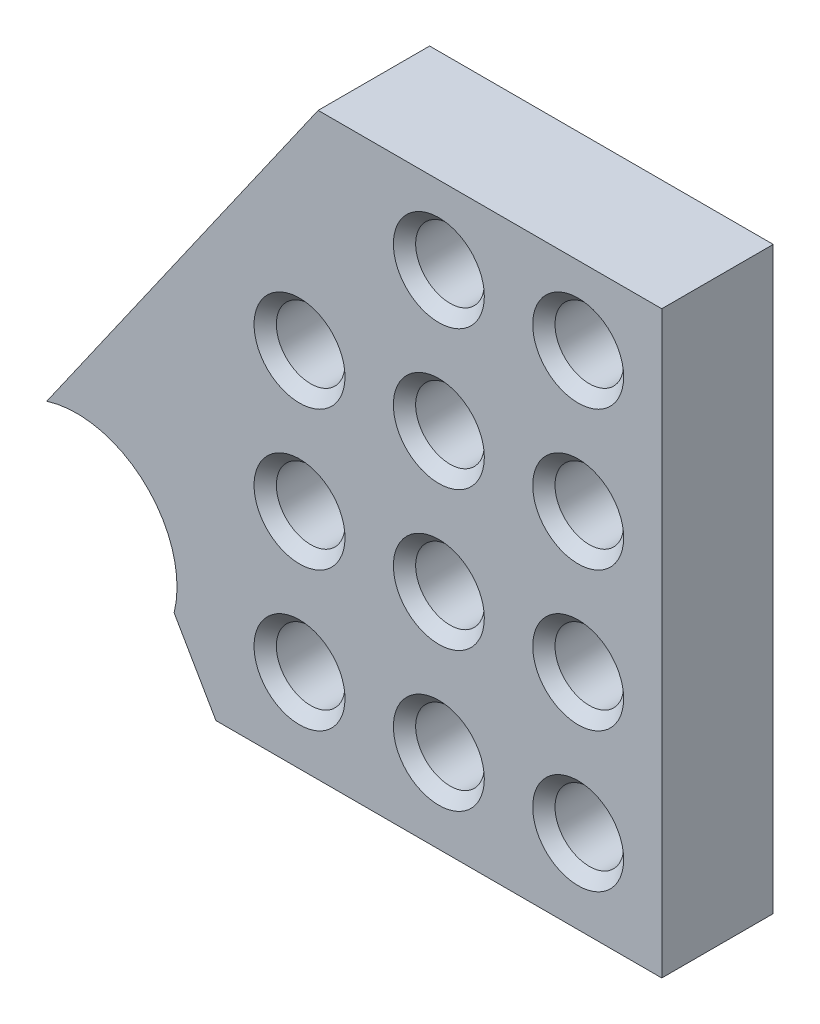
ISO-10303-21;
HEADER;
FILE_DESCRIPTION(('STEP AP214'),'2;1');
FILE_NAME('part.step','',(''),(''),'','','');
FILE_SCHEMA(('AUTOMOTIVE_DESIGN { 1 0 10303 214 1 1 1 1 }'));
ENDSEC;
DATA;
#1=APPLICATION_CONTEXT('core data for automotive mechanical design processes');
#2=APPLICATION_PROTOCOL_DEFINITION('international standard','automotive_design',2000,#1);
#3=PRODUCT_CONTEXT('',#1,'mechanical');
#4=PRODUCT('Part','Part','',(#3));
#5=PRODUCT_RELATED_PRODUCT_CATEGORY('part','',(#4));
#6=PRODUCT_DEFINITION_FORMATION('','',#4);
#7=PRODUCT_DEFINITION_CONTEXT('part definition',#1,'design');
#8=PRODUCT_DEFINITION('design','',#6,#7);
#9=PRODUCT_DEFINITION_SHAPE('','',#8);
#10=(LENGTH_UNIT() NAMED_UNIT(*) SI_UNIT(.MILLI.,.METRE.));
#11=(NAMED_UNIT(*) PLANE_ANGLE_UNIT() SI_UNIT($,.RADIAN.));
#12=(NAMED_UNIT(*) SI_UNIT($,.STERADIAN.) SOLID_ANGLE_UNIT());
#13=UNCERTAINTY_MEASURE_WITH_UNIT(LENGTH_MEASURE(1.E-05),#10,'distance_accuracy_value','');
#14=(GEOMETRIC_REPRESENTATION_CONTEXT(3) GLOBAL_UNCERTAINTY_ASSIGNED_CONTEXT((#13)) GLOBAL_UNIT_ASSIGNED_CONTEXT((#10,
#11,#12)) REPRESENTATION_CONTEXT('',''));
#15=CARTESIAN_POINT('',(0.,0.,0.));
#16=DIRECTION('',(0.,0.,1.));
#17=DIRECTION('',(1.,0.,0.));
#18=AXIS2_PLACEMENT_3D('',#15,#16,#17);
#19=CARTESIAN_POINT('',(-28.6502386222583,20.0611130548121,6.35));
#20=DIRECTION('',(0.819152044288993,-0.573576436351044,0.));
#21=DIRECTION('',(0.573576436351044,0.819152044288993,0.));
#22=AXIS2_PLACEMENT_3D('',#19,#20,#21);
#23=PLANE('',#22);
#24=DIRECTION('',(-0.573576436351044,-0.819152044288993,0.));
#25=VECTOR('',#24,1.);
#26=CARTESIAN_POINT('',(-28.6502386222583,20.0611130548121,0.));
#27=LINE('',#26,#25);
#28=CARTESIAN_POINT('',(-19.5763282964304,33.02,0.));
#29=VERTEX_POINT('',#28);
#30=CARTESIAN_POINT('',(-35.0379978292441,10.9384474758067,0.));
#31=VERTEX_POINT('',#30);
#32=EDGE_CURVE('E121',#29,#31,#27,.T.);
#33=ORIENTED_EDGE('',*,*,#32,.T.);
#34=DIRECTION('',(0.,0.,-1.));
#35=VECTOR('',#34,1.);
#36=CARTESIAN_POINT('',(-35.0379978292441,10.9384474758067,6.35));
#37=LINE('',#36,#35);
#38=CARTESIAN_POINT('',(-35.0379978292441,10.9384474758067,6.35));
#39=VERTEX_POINT('',#38);
#40=EDGE_CURVE('E11',#39,#31,#37,.T.);
#41=ORIENTED_EDGE('',*,*,#40,.F.);
#42=DIRECTION('',(-0.573576436351044,-0.819152044288993,0.));
#43=VECTOR('',#42,1.);
#44=CARTESIAN_POINT('',(-28.6502386222583,20.0611130548121,6.35));
#45=LINE('',#44,#43);
#46=CARTESIAN_POINT('',(-19.5763282964304,33.02,6.35));
#47=VERTEX_POINT('',#46);
#48=EDGE_CURVE('E132',#47,#39,#45,.T.);
#49=ORIENTED_EDGE('',*,*,#48,.F.);
#50=DIRECTION('',(0.,0.,-1.));
#51=VECTOR('',#50,1.);
#52=CARTESIAN_POINT('',(-19.5763282964304,33.02,6.35));
#53=LINE('',#52,#51);
#54=EDGE_CURVE('E117',#47,#29,#53,.T.);
#55=ORIENTED_EDGE('',*,*,#54,.T.);
#56=EDGE_LOOP('',(#33,#41,#49,#55));
#57=FACE_BOUND('',#56,.T.);
#58=ADVANCED_FACE('F37',(#57),#23,.F.);
#59=CARTESIAN_POINT('',(-33.332191415301,5.48395854666304,6.35));
#60=DIRECTION('',(0.,0.,-1.));
#61=DIRECTION('',(-1.,0.,0.));
#62=AXIS2_PLACEMENT_3D('',#59,#60,#61);
#63=CYLINDRICAL_SURFACE('',#62,5.71500000000001);
#64=CARTESIAN_POINT('',(-33.332191415301,5.48395854666304,0.));
#65=DIRECTION('',(0.,0.,1.));
#66=DIRECTION('',(1.,0.,0.));
#67=AXIS2_PLACEMENT_3D('',#64,#65,#66);
#68=CIRCLE('',#67,5.71500000000001);
#69=CARTESIAN_POINT('',(-27.78125,4.12444598552339,0.));
#70=VERTEX_POINT('',#69);
#71=EDGE_CURVE('E124',#31,#70,#68,.F.);
#72=ORIENTED_EDGE('',*,*,#71,.T.);
#73=DIRECTION('',(0.,0.,-1.));
#74=VECTOR('',#73,1.);
#75=CARTESIAN_POINT('',(-27.78125,4.12444598552339,6.35));
#76=LINE('',#75,#74);
#77=CARTESIAN_POINT('',(-27.78125,4.12444598552339,6.35));
#78=VERTEX_POINT('',#77);
#79=EDGE_CURVE('E45',#78,#70,#76,.T.);
#80=ORIENTED_EDGE('',*,*,#79,.F.);
#81=CARTESIAN_POINT('',(-33.332191415301,5.48395854666304,6.35));
#82=DIRECTION('',(0.,0.,1.));
#83=DIRECTION('',(1.,0.,0.));
#84=AXIS2_PLACEMENT_3D('',#81,#82,#83);
#85=CIRCLE('',#84,5.71500000000001);
#86=EDGE_CURVE('E90',#39,#78,#85,.F.);
#87=ORIENTED_EDGE('',*,*,#86,.F.);
#88=ORIENTED_EDGE('',*,*,#40,.T.);
#89=EDGE_LOOP('',(#72,#80,#87,#88));
#90=FACE_BOUND('',#89,.T.);
#91=ADVANCED_FACE('F157',(#90),#63,.F.);
#92=CARTESIAN_POINT('',(-19.0500000000001,-10.9985226280623,6.35));
#93=DIRECTION('',(0.86602540378444,0.499999999999998,0.));
#94=DIRECTION('',(-0.499999999999998,0.86602540378444,0.));
#95=AXIS2_PLACEMENT_3D('',#92,#93,#94);
#96=PLANE('',#95);
#97=DIRECTION('',(0.499999999999998,-0.86602540378444,0.));
#98=VECTOR('',#97,1.);
#99=CARTESIAN_POINT('',(-19.0500000000001,-10.9985226280623,0.));
#100=LINE('',#99,#98);
#101=CARTESIAN_POINT('',(-25.4,0.,0.));
#102=VERTEX_POINT('',#101);
#103=EDGE_CURVE('E127',#70,#102,#100,.T.);
#104=ORIENTED_EDGE('',*,*,#103,.T.);
#105=DIRECTION('',(0.,0.,-1.));
#106=VECTOR('',#105,1.);
#107=CARTESIAN_POINT('',(-25.4,0.,6.35));
#108=LINE('',#107,#106);
#109=CARTESIAN_POINT('',(-25.4,0.,6.35));
#110=VERTEX_POINT('',#109);
#111=EDGE_CURVE('E112',#110,#102,#108,.T.);
#112=ORIENTED_EDGE('',*,*,#111,.F.);
#113=DIRECTION('',(0.499999999999998,-0.86602540378444,0.));
#114=VECTOR('',#113,1.);
#115=CARTESIAN_POINT('',(-19.0500000000001,-10.9985226280623,6.35));
#116=LINE('',#115,#114);
#117=EDGE_CURVE('E103',#78,#110,#116,.T.);
#118=ORIENTED_EDGE('',*,*,#117,.F.);
#119=ORIENTED_EDGE('',*,*,#79,.T.);
#120=EDGE_LOOP('',(#104,#112,#118,#119));
#121=FACE_BOUND('',#120,.T.);
#122=ADVANCED_FACE('F138',(#121),#96,.F.);
#123=CARTESIAN_POINT('',(0.,0.,6.35));
#124=DIRECTION('',(0.,1.,0.));
#125=DIRECTION('',(0.,0.,1.));
#126=AXIS2_PLACEMENT_3D('',#123,#124,#125);
#127=PLANE('',#126);
#128=DIRECTION('',(1.,0.,0.));
#129=VECTOR('',#128,1.);
#130=CARTESIAN_POINT('',(0.,0.,0.));
#131=LINE('',#130,#129);
#132=CARTESIAN_POINT('',(0.,0.,0.));
#133=VERTEX_POINT('',#132);
#134=EDGE_CURVE('E111',#102,#133,#131,.T.);
#135=ORIENTED_EDGE('',*,*,#134,.T.);
#136=DIRECTION('',(0.,0.,-1.));
#137=VECTOR('',#136,1.);
#138=CARTESIAN_POINT('',(0.,0.,6.35));
#139=LINE('',#138,#137);
#140=CARTESIAN_POINT('',(0.,0.,6.35));
#141=VERTEX_POINT('',#140);
#142=EDGE_CURVE('E108',#141,#133,#139,.T.);
#143=ORIENTED_EDGE('',*,*,#142,.F.);
#144=DIRECTION('',(1.,0.,0.));
#145=VECTOR('',#144,1.);
#146=CARTESIAN_POINT('',(0.,0.,6.35));
#147=LINE('',#146,#145);
#148=EDGE_CURVE('E97',#110,#141,#147,.T.);
#149=ORIENTED_EDGE('',*,*,#148,.F.);
#150=ORIENTED_EDGE('',*,*,#111,.T.);
#151=EDGE_LOOP('',(#135,#143,#149,#150));
#152=FACE_BOUND('',#151,.T.);
#153=ADVANCED_FACE('F109',(#152),#127,.F.);
#154=CARTESIAN_POINT('',(0.,0.,6.35));
#155=DIRECTION('',(-1.,0.,0.));
#156=DIRECTION('',(0.,0.,1.));
#157=AXIS2_PLACEMENT_3D('',#154,#155,#156);
#158=PLANE('',#157);
#159=DIRECTION('',(0.,1.,0.));
#160=VECTOR('',#159,1.);
#161=CARTESIAN_POINT('',(0.,0.,0.));
#162=LINE('',#161,#160);
#163=CARTESIAN_POINT('',(0.,33.02,0.));
#164=VERTEX_POINT('',#163);
#165=EDGE_CURVE('E76',#133,#164,#162,.T.);
#166=ORIENTED_EDGE('',*,*,#165,.T.);
#167=DIRECTION('',(0.,0.,-1.));
#168=VECTOR('',#167,1.);
#169=CARTESIAN_POINT('',(0.,33.02,6.35));
#170=LINE('',#169,#168);
#171=CARTESIAN_POINT('',(0.,33.02,6.35));
#172=VERTEX_POINT('',#171);
#173=EDGE_CURVE('E113',#172,#164,#170,.T.);
#174=ORIENTED_EDGE('',*,*,#173,.F.);
#175=DIRECTION('',(0.,1.,0.));
#176=VECTOR('',#175,1.);
#177=CARTESIAN_POINT('',(0.,0.,6.35));
#178=LINE('',#177,#176);
#179=EDGE_CURVE('E101',#141,#172,#178,.T.);
#180=ORIENTED_EDGE('',*,*,#179,.F.);
#181=ORIENTED_EDGE('',*,*,#142,.T.);
#182=EDGE_LOOP('',(#166,#174,#180,#181));
#183=FACE_BOUND('',#182,.T.);
#184=ADVANCED_FACE('F115',(#183),#158,.F.);
#185=CARTESIAN_POINT('',(0.,33.02,6.35));
#186=DIRECTION('',(0.,-1.,0.));
#187=DIRECTION('',(0.,0.,-1.));
#188=AXIS2_PLACEMENT_3D('',#185,#186,#187);
#189=PLANE('',#188);
#190=DIRECTION('',(-1.,0.,0.));
#191=VECTOR('',#190,1.);
#192=CARTESIAN_POINT('',(0.,33.02,0.));
#193=LINE('',#192,#191);
#194=EDGE_CURVE('E82',#164,#29,#193,.T.);
#195=ORIENTED_EDGE('',*,*,#194,.T.);
#196=ORIENTED_EDGE('',*,*,#54,.F.);
#197=DIRECTION('',(-1.,0.,0.));
#198=VECTOR('',#197,1.);
#199=CARTESIAN_POINT('',(0.,33.02,6.35));
#200=LINE('',#199,#198);
#201=EDGE_CURVE('E53',#172,#47,#200,.T.);
#202=ORIENTED_EDGE('',*,*,#201,.F.);
#203=ORIENTED_EDGE('',*,*,#173,.T.);
#204=EDGE_LOOP('',(#195,#196,#202,#203));
#205=FACE_BOUND('',#204,.T.);
#206=ADVANCED_FACE('F145',(#205),#189,.F.);
#207=CARTESIAN_POINT('',(0.,0.,6.35));
#208=DIRECTION('',(0.,0.,1.));
#209=DIRECTION('',(1.,0.,0.));
#210=AXIS2_PLACEMENT_3D('',#207,#208,#209);
#211=PLANE('',#210);
#212=CARTESIAN_POINT('',(-12.7,28.575,6.35));
#213=DIRECTION('',(0.,0.,1.));
#214=DIRECTION('',(1.,0.,0.));
#215=AXIS2_PLACEMENT_3D('',#212,#213,#214);
#216=CIRCLE('',#215,2.5908);
#217=CARTESIAN_POINT('',(-10.1092,28.575,6.35));
#218=VERTEX_POINT('',#217);
#219=EDGE_CURVE('E427',#218,#218,#216,.T.);
#220=ORIENTED_EDGE('',*,*,#219,.F.);
#221=EDGE_LOOP('',(#220));
#222=FACE_BOUND('',#221,.T.);
#223=CARTESIAN_POINT('',(-4.7625,28.575,6.35));
#224=DIRECTION('',(0.,0.,1.));
#225=DIRECTION('',(1.,0.,0.));
#226=AXIS2_PLACEMENT_3D('',#223,#224,#225);
#227=CIRCLE('',#226,2.5908);
#228=CARTESIAN_POINT('',(-2.1717,28.575,6.35));
#229=VERTEX_POINT('',#228);
#230=EDGE_CURVE('E434',#229,#229,#227,.T.);
#231=ORIENTED_EDGE('',*,*,#230,.F.);
#232=EDGE_LOOP('',(#231));
#233=FACE_BOUND('',#232,.T.);
#234=CARTESIAN_POINT('',(-20.6375,20.6375,6.35));
#235=DIRECTION('',(0.,0.,1.));
#236=DIRECTION('',(1.,0.,0.));
#237=AXIS2_PLACEMENT_3D('',#234,#235,#236);
#238=CIRCLE('',#237,2.5908);
#239=CARTESIAN_POINT('',(-18.0467,20.6375,6.35));
#240=VERTEX_POINT('',#239);
#241=EDGE_CURVE('E443',#240,#240,#238,.T.);
#242=ORIENTED_EDGE('',*,*,#241,.F.);
#243=EDGE_LOOP('',(#242));
#244=FACE_BOUND('',#243,.T.);
#245=CARTESIAN_POINT('',(-12.7,20.6375,6.35));
#246=DIRECTION('',(0.,0.,1.));
#247=DIRECTION('',(1.,0.,0.));
#248=AXIS2_PLACEMENT_3D('',#245,#246,#247);
#249=CIRCLE('',#248,2.5908);
#250=CARTESIAN_POINT('',(-10.1092,20.6375,6.35));
#251=VERTEX_POINT('',#250);
#252=EDGE_CURVE('E452',#251,#251,#249,.T.);
#253=ORIENTED_EDGE('',*,*,#252,.F.);
#254=EDGE_LOOP('',(#253));
#255=FACE_BOUND('',#254,.T.);
#256=CARTESIAN_POINT('',(-4.7625,20.6375,6.35));
#257=DIRECTION('',(0.,0.,1.));
#258=DIRECTION('',(1.,0.,0.));
#259=AXIS2_PLACEMENT_3D('',#256,#257,#258);
#260=CIRCLE('',#259,2.5908);
#261=CARTESIAN_POINT('',(-2.1717,20.6375,6.35));
#262=VERTEX_POINT('',#261);
#263=EDGE_CURVE('E461',#262,#262,#260,.T.);
#264=ORIENTED_EDGE('',*,*,#263,.F.);
#265=EDGE_LOOP('',(#264));
#266=FACE_BOUND('',#265,.T.);
#267=CARTESIAN_POINT('',(-20.6375,12.7,6.35));
#268=DIRECTION('',(0.,0.,1.));
#269=DIRECTION('',(1.,0.,0.));
#270=AXIS2_PLACEMENT_3D('',#267,#268,#269);
#271=CIRCLE('',#270,2.5908);
#272=CARTESIAN_POINT('',(-18.0467,12.7,6.35));
#273=VERTEX_POINT('',#272);
#274=EDGE_CURVE('E470',#273,#273,#271,.T.);
#275=ORIENTED_EDGE('',*,*,#274,.F.);
#276=EDGE_LOOP('',(#275));
#277=FACE_BOUND('',#276,.T.);
#278=CARTESIAN_POINT('',(-12.7,12.7,6.35));
#279=DIRECTION('',(0.,0.,1.));
#280=DIRECTION('',(1.,0.,0.));
#281=AXIS2_PLACEMENT_3D('',#278,#279,#280);
#282=CIRCLE('',#281,2.5908);
#283=CARTESIAN_POINT('',(-10.1092,12.7,6.35));
#284=VERTEX_POINT('',#283);
#285=EDGE_CURVE('E479',#284,#284,#282,.T.);
#286=ORIENTED_EDGE('',*,*,#285,.F.);
#287=EDGE_LOOP('',(#286));
#288=FACE_BOUND('',#287,.T.);
#289=CARTESIAN_POINT('',(-4.7625,12.7,6.35));
#290=DIRECTION('',(0.,0.,1.));
#291=DIRECTION('',(1.,0.,0.));
#292=AXIS2_PLACEMENT_3D('',#289,#290,#291);
#293=CIRCLE('',#292,2.5908);
#294=CARTESIAN_POINT('',(-2.1717,12.7,6.35));
#295=VERTEX_POINT('',#294);
#296=EDGE_CURVE('E488',#295,#295,#293,.T.);
#297=ORIENTED_EDGE('',*,*,#296,.F.);
#298=EDGE_LOOP('',(#297));
#299=FACE_BOUND('',#298,.T.);
#300=CARTESIAN_POINT('',(-20.6375,4.7625,6.35));
#301=DIRECTION('',(0.,0.,1.));
#302=DIRECTION('',(1.,0.,0.));
#303=AXIS2_PLACEMENT_3D('',#300,#301,#302);
#304=CIRCLE('',#303,2.5908);
#305=CARTESIAN_POINT('',(-18.0467,4.7625,6.35));
#306=VERTEX_POINT('',#305);
#307=EDGE_CURVE('E497',#306,#306,#304,.T.);
#308=ORIENTED_EDGE('',*,*,#307,.F.);
#309=EDGE_LOOP('',(#308));
#310=FACE_BOUND('',#309,.T.);
#311=CARTESIAN_POINT('',(-12.7,4.7625,6.35));
#312=DIRECTION('',(0.,0.,1.));
#313=DIRECTION('',(1.,0.,0.));
#314=AXIS2_PLACEMENT_3D('',#311,#312,#313);
#315=CIRCLE('',#314,2.5908);
#316=CARTESIAN_POINT('',(-10.1092,4.7625,6.35));
#317=VERTEX_POINT('',#316);
#318=EDGE_CURVE('E506',#317,#317,#315,.T.);
#319=ORIENTED_EDGE('',*,*,#318,.F.);
#320=EDGE_LOOP('',(#319));
#321=FACE_BOUND('',#320,.T.);
#322=CARTESIAN_POINT('',(-4.7625,4.7625,6.35));
#323=DIRECTION('',(0.,0.,1.));
#324=DIRECTION('',(1.,0.,0.));
#325=AXIS2_PLACEMENT_3D('',#322,#323,#324);
#326=CIRCLE('',#325,2.5908);
#327=CARTESIAN_POINT('',(-2.1717,4.7625,6.35));
#328=VERTEX_POINT('',#327);
#329=EDGE_CURVE('E515',#328,#328,#326,.T.);
#330=ORIENTED_EDGE('',*,*,#329,.F.);
#331=EDGE_LOOP('',(#330));
#332=FACE_BOUND('',#331,.T.);
#333=ORIENTED_EDGE('',*,*,#48,.T.);
#334=ORIENTED_EDGE('',*,*,#86,.T.);
#335=ORIENTED_EDGE('',*,*,#117,.T.);
#336=ORIENTED_EDGE('',*,*,#148,.T.);
#337=ORIENTED_EDGE('',*,*,#179,.T.);
#338=ORIENTED_EDGE('',*,*,#201,.T.);
#339=EDGE_LOOP('',(#333,#334,#335,#336,#337,#338));
#340=FACE_BOUND('',#339,.T.);
#341=ADVANCED_FACE('F99',(#222,#233,#244,#255,#266,#277,#288,#299,#310,#321,#332,#340),#211,.T.);
#342=CARTESIAN_POINT('',(0.,0.,0.));
#343=DIRECTION('',(0.,0.,1.));
#344=DIRECTION('',(1.,0.,0.));
#345=AXIS2_PLACEMENT_3D('',#342,#343,#344);
#346=PLANE('',#345);
#347=CARTESIAN_POINT('',(-12.7,28.575,0.));
#348=DIRECTION('',(0.,0.,1.));
#349=DIRECTION('',(1.,0.,0.));
#350=AXIS2_PLACEMENT_3D('',#347,#348,#349);
#351=CIRCLE('',#350,1.95579999999999);
#352=CARTESIAN_POINT('',(-10.7442,28.575,0.));
#353=VERTEX_POINT('',#352);
#354=EDGE_CURVE('E429',#353,#353,#351,.T.);
#355=ORIENTED_EDGE('',*,*,#354,.T.);
#356=EDGE_LOOP('',(#355));
#357=FACE_BOUND('',#356,.T.);
#358=CARTESIAN_POINT('',(-4.7625,28.575,0.));
#359=DIRECTION('',(0.,0.,1.));
#360=DIRECTION('',(1.,0.,0.));
#361=AXIS2_PLACEMENT_3D('',#358,#359,#360);
#362=CIRCLE('',#361,1.95579999999999);
#363=CARTESIAN_POINT('',(-2.80670000000001,28.575,0.));
#364=VERTEX_POINT('',#363);
#365=EDGE_CURVE('E440',#364,#364,#362,.T.);
#366=ORIENTED_EDGE('',*,*,#365,.T.);
#367=EDGE_LOOP('',(#366));
#368=FACE_BOUND('',#367,.T.);
#369=CARTESIAN_POINT('',(-20.6375,20.6375,0.));
#370=DIRECTION('',(0.,0.,1.));
#371=DIRECTION('',(1.,0.,0.));
#372=AXIS2_PLACEMENT_3D('',#369,#370,#371);
#373=CIRCLE('',#372,1.95579999999999);
#374=CARTESIAN_POINT('',(-18.6817,20.6375,0.));
#375=VERTEX_POINT('',#374);
#376=EDGE_CURVE('E449',#375,#375,#373,.T.);
#377=ORIENTED_EDGE('',*,*,#376,.T.);
#378=EDGE_LOOP('',(#377));
#379=FACE_BOUND('',#378,.T.);
#380=CARTESIAN_POINT('',(-12.7,20.6375,0.));
#381=DIRECTION('',(0.,0.,1.));
#382=DIRECTION('',(1.,0.,0.));
#383=AXIS2_PLACEMENT_3D('',#380,#381,#382);
#384=CIRCLE('',#383,1.95579999999999);
#385=CARTESIAN_POINT('',(-10.7442,20.6375,0.));
#386=VERTEX_POINT('',#385);
#387=EDGE_CURVE('E458',#386,#386,#384,.T.);
#388=ORIENTED_EDGE('',*,*,#387,.T.);
#389=EDGE_LOOP('',(#388));
#390=FACE_BOUND('',#389,.T.);
#391=CARTESIAN_POINT('',(-4.7625,20.6375,0.));
#392=DIRECTION('',(0.,0.,1.));
#393=DIRECTION('',(1.,0.,0.));
#394=AXIS2_PLACEMENT_3D('',#391,#392,#393);
#395=CIRCLE('',#394,1.95579999999999);
#396=CARTESIAN_POINT('',(-2.80670000000001,20.6375,0.));
#397=VERTEX_POINT('',#396);
#398=EDGE_CURVE('E467',#397,#397,#395,.T.);
#399=ORIENTED_EDGE('',*,*,#398,.T.);
#400=EDGE_LOOP('',(#399));
#401=FACE_BOUND('',#400,.T.);
#402=CARTESIAN_POINT('',(-20.6375,12.7,0.));
#403=DIRECTION('',(0.,0.,1.));
#404=DIRECTION('',(1.,0.,0.));
#405=AXIS2_PLACEMENT_3D('',#402,#403,#404);
#406=CIRCLE('',#405,1.95579999999999);
#407=CARTESIAN_POINT('',(-18.6817,12.7,0.));
#408=VERTEX_POINT('',#407);
#409=EDGE_CURVE('E476',#408,#408,#406,.T.);
#410=ORIENTED_EDGE('',*,*,#409,.T.);
#411=EDGE_LOOP('',(#410));
#412=FACE_BOUND('',#411,.T.);
#413=CARTESIAN_POINT('',(-12.7,12.7,0.));
#414=DIRECTION('',(0.,0.,1.));
#415=DIRECTION('',(1.,0.,0.));
#416=AXIS2_PLACEMENT_3D('',#413,#414,#415);
#417=CIRCLE('',#416,1.95579999999999);
#418=CARTESIAN_POINT('',(-10.7442,12.7,0.));
#419=VERTEX_POINT('',#418);
#420=EDGE_CURVE('E485',#419,#419,#417,.T.);
#421=ORIENTED_EDGE('',*,*,#420,.T.);
#422=EDGE_LOOP('',(#421));
#423=FACE_BOUND('',#422,.T.);
#424=CARTESIAN_POINT('',(-4.7625,12.7,0.));
#425=DIRECTION('',(0.,0.,1.));
#426=DIRECTION('',(1.,0.,0.));
#427=AXIS2_PLACEMENT_3D('',#424,#425,#426);
#428=CIRCLE('',#427,1.95579999999999);
#429=CARTESIAN_POINT('',(-2.80670000000001,12.7,0.));
#430=VERTEX_POINT('',#429);
#431=EDGE_CURVE('E494',#430,#430,#428,.T.);
#432=ORIENTED_EDGE('',*,*,#431,.T.);
#433=EDGE_LOOP('',(#432));
#434=FACE_BOUND('',#433,.T.);
#435=CARTESIAN_POINT('',(-20.6375,4.7625,0.));
#436=DIRECTION('',(0.,0.,1.));
#437=DIRECTION('',(1.,0.,0.));
#438=AXIS2_PLACEMENT_3D('',#435,#436,#437);
#439=CIRCLE('',#438,1.95579999999999);
#440=CARTESIAN_POINT('',(-18.6817,4.7625,0.));
#441=VERTEX_POINT('',#440);
#442=EDGE_CURVE('E503',#441,#441,#439,.T.);
#443=ORIENTED_EDGE('',*,*,#442,.T.);
#444=EDGE_LOOP('',(#443));
#445=FACE_BOUND('',#444,.T.);
#446=CARTESIAN_POINT('',(-12.7,4.7625,0.));
#447=DIRECTION('',(0.,0.,1.));
#448=DIRECTION('',(1.,0.,0.));
#449=AXIS2_PLACEMENT_3D('',#446,#447,#448);
#450=CIRCLE('',#449,1.95579999999999);
#451=CARTESIAN_POINT('',(-10.7442,4.7625,0.));
#452=VERTEX_POINT('',#451);
#453=EDGE_CURVE('E512',#452,#452,#450,.T.);
#454=ORIENTED_EDGE('',*,*,#453,.T.);
#455=EDGE_LOOP('',(#454));
#456=FACE_BOUND('',#455,.T.);
#457=CARTESIAN_POINT('',(-4.7625,4.7625,0.));
#458=DIRECTION('',(0.,0.,1.));
#459=DIRECTION('',(1.,0.,0.));
#460=AXIS2_PLACEMENT_3D('',#457,#458,#459);
#461=CIRCLE('',#460,1.95579999999999);
#462=CARTESIAN_POINT('',(-2.80670000000001,4.7625,0.));
#463=VERTEX_POINT('',#462);
#464=EDGE_CURVE('E125',#463,#463,#461,.T.);
#465=ORIENTED_EDGE('',*,*,#464,.T.);
#466=EDGE_LOOP('',(#465));
#467=FACE_BOUND('',#466,.T.);
#468=ORIENTED_EDGE('',*,*,#32,.F.);
#469=ORIENTED_EDGE('',*,*,#194,.F.);
#470=ORIENTED_EDGE('',*,*,#165,.F.);
#471=ORIENTED_EDGE('',*,*,#134,.F.);
#472=ORIENTED_EDGE('',*,*,#103,.F.);
#473=ORIENTED_EDGE('',*,*,#71,.F.);
#474=EDGE_LOOP('',(#468,#469,#470,#471,#472,#473));
#475=FACE_BOUND('',#474,.T.);
#476=ADVANCED_FACE('F141',(#357,#368,#379,#390,#401,#412,#423,#434,#445,#456,#467,#475),#346,.F.);
#477=CARTESIAN_POINT('',(-4.7625,4.7625,6.35));
#478=DIRECTION('',(0.,0.,1.));
#479=DIRECTION('',(1.,0.,0.));
#480=AXIS2_PLACEMENT_3D('',#477,#478,#479);
#481=CYLINDRICAL_SURFACE('',#480,1.95579999999999);
#482=ORIENTED_EDGE('',*,*,#464,.F.);
#483=EDGE_LOOP('',(#482));
#484=FACE_BOUND('',#483,.T.);
#485=CARTESIAN_POINT('',(-4.7625,4.7625,5.71499999999999));
#486=DIRECTION('',(0.,0.,1.));
#487=DIRECTION('',(1.,0.,0.));
#488=AXIS2_PLACEMENT_3D('',#485,#486,#487);
#489=CIRCLE('',#488,1.95579999999999);
#490=CARTESIAN_POINT('',(-2.80670000000001,4.7625,5.71499999999999));
#491=VERTEX_POINT('',#490);
#492=EDGE_CURVE('E518',#491,#491,#489,.T.);
#493=ORIENTED_EDGE('',*,*,#492,.T.);
#494=EDGE_LOOP('',(#493));
#495=FACE_BOUND('',#494,.T.);
#496=ADVANCED_FACE('F185',(#484,#495),#481,.F.);
#497=CARTESIAN_POINT('',(-4.7625,4.7625,6.35));
#498=DIRECTION('',(0.,0.,1.));
#499=DIRECTION('',(1.,0.,0.));
#500=AXIS2_PLACEMENT_3D('',#497,#498,#499);
#501=CONICAL_SURFACE('',#500,2.5908,0.78539816339745);
#502=ORIENTED_EDGE('',*,*,#492,.F.);
#503=EDGE_LOOP('',(#502));
#504=FACE_BOUND('',#503,.T.);
#505=ORIENTED_EDGE('',*,*,#329,.T.);
#506=EDGE_LOOP('',(#505));
#507=FACE_BOUND('',#506,.T.);
#508=ADVANCED_FACE('F190',(#504,#507),#501,.F.);
#509=CARTESIAN_POINT('',(-12.7,4.7625,6.35));
#510=DIRECTION('',(0.,0.,1.));
#511=DIRECTION('',(1.,0.,0.));
#512=AXIS2_PLACEMENT_3D('',#509,#510,#511);
#513=CYLINDRICAL_SURFACE('',#512,1.95579999999999);
#514=ORIENTED_EDGE('',*,*,#453,.F.);
#515=EDGE_LOOP('',(#514));
#516=FACE_BOUND('',#515,.T.);
#517=CARTESIAN_POINT('',(-12.7,4.7625,5.71499999999999));
#518=DIRECTION('',(0.,0.,1.));
#519=DIRECTION('',(1.,0.,0.));
#520=AXIS2_PLACEMENT_3D('',#517,#518,#519);
#521=CIRCLE('',#520,1.95579999999999);
#522=CARTESIAN_POINT('',(-10.7442,4.7625,5.71499999999999));
#523=VERTEX_POINT('',#522);
#524=EDGE_CURVE('E509',#523,#523,#521,.T.);
#525=ORIENTED_EDGE('',*,*,#524,.T.);
#526=EDGE_LOOP('',(#525));
#527=FACE_BOUND('',#526,.T.);
#528=ADVANCED_FACE('F202',(#516,#527),#513,.F.);
#529=CARTESIAN_POINT('',(-12.7,4.7625,6.35));
#530=DIRECTION('',(0.,0.,1.));
#531=DIRECTION('',(1.,0.,0.));
#532=AXIS2_PLACEMENT_3D('',#529,#530,#531);
#533=CONICAL_SURFACE('',#532,2.5908,0.78539816339745);
#534=ORIENTED_EDGE('',*,*,#524,.F.);
#535=EDGE_LOOP('',(#534));
#536=FACE_BOUND('',#535,.T.);
#537=ORIENTED_EDGE('',*,*,#318,.T.);
#538=EDGE_LOOP('',(#537));
#539=FACE_BOUND('',#538,.T.);
#540=ADVANCED_FACE('F227',(#536,#539),#533,.F.);
#541=CARTESIAN_POINT('',(-20.6375,4.7625,6.35));
#542=DIRECTION('',(0.,0.,1.));
#543=DIRECTION('',(1.,0.,0.));
#544=AXIS2_PLACEMENT_3D('',#541,#542,#543);
#545=CYLINDRICAL_SURFACE('',#544,1.95579999999999);
#546=ORIENTED_EDGE('',*,*,#442,.F.);
#547=EDGE_LOOP('',(#546));
#548=FACE_BOUND('',#547,.T.);
#549=CARTESIAN_POINT('',(-20.6375,4.7625,5.71499999999999));
#550=DIRECTION('',(0.,0.,1.));
#551=DIRECTION('',(1.,0.,0.));
#552=AXIS2_PLACEMENT_3D('',#549,#550,#551);
#553=CIRCLE('',#552,1.95579999999999);
#554=CARTESIAN_POINT('',(-18.6817,4.7625,5.71499999999999));
#555=VERTEX_POINT('',#554);
#556=EDGE_CURVE('E500',#555,#555,#553,.T.);
#557=ORIENTED_EDGE('',*,*,#556,.T.);
#558=EDGE_LOOP('',(#557));
#559=FACE_BOUND('',#558,.T.);
#560=ADVANCED_FACE('F237',(#548,#559),#545,.F.);
#561=CARTESIAN_POINT('',(-20.6375,4.7625,6.35));
#562=DIRECTION('',(0.,0.,1.));
#563=DIRECTION('',(1.,0.,0.));
#564=AXIS2_PLACEMENT_3D('',#561,#562,#563);
#565=CONICAL_SURFACE('',#564,2.5908,0.78539816339745);
#566=ORIENTED_EDGE('',*,*,#556,.F.);
#567=EDGE_LOOP('',(#566));
#568=FACE_BOUND('',#567,.T.);
#569=ORIENTED_EDGE('',*,*,#307,.T.);
#570=EDGE_LOOP('',(#569));
#571=FACE_BOUND('',#570,.T.);
#572=ADVANCED_FACE('F247',(#568,#571),#565,.F.);
#573=CARTESIAN_POINT('',(-4.7625,12.7,6.35));
#574=DIRECTION('',(0.,0.,1.));
#575=DIRECTION('',(1.,0.,0.));
#576=AXIS2_PLACEMENT_3D('',#573,#574,#575);
#577=CYLINDRICAL_SURFACE('',#576,1.95579999999999);
#578=ORIENTED_EDGE('',*,*,#431,.F.);
#579=EDGE_LOOP('',(#578));
#580=FACE_BOUND('',#579,.T.);
#581=CARTESIAN_POINT('',(-4.7625,12.7,5.71499999999999));
#582=DIRECTION('',(0.,0.,1.));
#583=DIRECTION('',(1.,0.,0.));
#584=AXIS2_PLACEMENT_3D('',#581,#582,#583);
#585=CIRCLE('',#584,1.95579999999999);
#586=CARTESIAN_POINT('',(-2.80670000000001,12.7,5.71499999999999));
#587=VERTEX_POINT('',#586);
#588=EDGE_CURVE('E491',#587,#587,#585,.T.);
#589=ORIENTED_EDGE('',*,*,#588,.T.);
#590=EDGE_LOOP('',(#589));
#591=FACE_BOUND('',#590,.T.);
#592=ADVANCED_FACE('F257',(#580,#591),#577,.F.);
#593=CARTESIAN_POINT('',(-4.7625,12.7,6.35));
#594=DIRECTION('',(0.,0.,1.));
#595=DIRECTION('',(1.,0.,0.));
#596=AXIS2_PLACEMENT_3D('',#593,#594,#595);
#597=CONICAL_SURFACE('',#596,2.5908,0.78539816339745);
#598=ORIENTED_EDGE('',*,*,#588,.F.);
#599=EDGE_LOOP('',(#598));
#600=FACE_BOUND('',#599,.T.);
#601=ORIENTED_EDGE('',*,*,#296,.T.);
#602=EDGE_LOOP('',(#601));
#603=FACE_BOUND('',#602,.T.);
#604=ADVANCED_FACE('F267',(#600,#603),#597,.F.);
#605=CARTESIAN_POINT('',(-12.7,12.7,6.35));
#606=DIRECTION('',(0.,0.,1.));
#607=DIRECTION('',(1.,0.,0.));
#608=AXIS2_PLACEMENT_3D('',#605,#606,#607);
#609=CYLINDRICAL_SURFACE('',#608,1.95579999999999);
#610=ORIENTED_EDGE('',*,*,#420,.F.);
#611=EDGE_LOOP('',(#610));
#612=FACE_BOUND('',#611,.T.);
#613=CARTESIAN_POINT('',(-12.7,12.7,5.71499999999999));
#614=DIRECTION('',(0.,0.,1.));
#615=DIRECTION('',(1.,0.,0.));
#616=AXIS2_PLACEMENT_3D('',#613,#614,#615);
#617=CIRCLE('',#616,1.95579999999999);
#618=CARTESIAN_POINT('',(-10.7442,12.7,5.71499999999999));
#619=VERTEX_POINT('',#618);
#620=EDGE_CURVE('E482',#619,#619,#617,.T.);
#621=ORIENTED_EDGE('',*,*,#620,.T.);
#622=EDGE_LOOP('',(#621));
#623=FACE_BOUND('',#622,.T.);
#624=ADVANCED_FACE('F277',(#612,#623),#609,.F.);
#625=CARTESIAN_POINT('',(-12.7,12.7,6.35));
#626=DIRECTION('',(0.,0.,1.));
#627=DIRECTION('',(1.,0.,0.));
#628=AXIS2_PLACEMENT_3D('',#625,#626,#627);
#629=CONICAL_SURFACE('',#628,2.5908,0.78539816339745);
#630=ORIENTED_EDGE('',*,*,#620,.F.);
#631=EDGE_LOOP('',(#630));
#632=FACE_BOUND('',#631,.T.);
#633=ORIENTED_EDGE('',*,*,#285,.T.);
#634=EDGE_LOOP('',(#633));
#635=FACE_BOUND('',#634,.T.);
#636=ADVANCED_FACE('F287',(#632,#635),#629,.F.);
#637=CARTESIAN_POINT('',(-20.6375,12.7,6.35));
#638=DIRECTION('',(0.,0.,1.));
#639=DIRECTION('',(1.,0.,0.));
#640=AXIS2_PLACEMENT_3D('',#637,#638,#639);
#641=CYLINDRICAL_SURFACE('',#640,1.95579999999999);
#642=ORIENTED_EDGE('',*,*,#409,.F.);
#643=EDGE_LOOP('',(#642));
#644=FACE_BOUND('',#643,.T.);
#645=CARTESIAN_POINT('',(-20.6375,12.7,5.71499999999999));
#646=DIRECTION('',(0.,0.,1.));
#647=DIRECTION('',(1.,0.,0.));
#648=AXIS2_PLACEMENT_3D('',#645,#646,#647);
#649=CIRCLE('',#648,1.95579999999999);
#650=CARTESIAN_POINT('',(-18.6817,12.7,5.71499999999999));
#651=VERTEX_POINT('',#650);
#652=EDGE_CURVE('E473',#651,#651,#649,.T.);
#653=ORIENTED_EDGE('',*,*,#652,.T.);
#654=EDGE_LOOP('',(#653));
#655=FACE_BOUND('',#654,.T.);
#656=ADVANCED_FACE('F297',(#644,#655),#641,.F.);
#657=CARTESIAN_POINT('',(-20.6375,12.7,6.35));
#658=DIRECTION('',(0.,0.,1.));
#659=DIRECTION('',(1.,0.,0.));
#660=AXIS2_PLACEMENT_3D('',#657,#658,#659);
#661=CONICAL_SURFACE('',#660,2.5908,0.78539816339745);
#662=ORIENTED_EDGE('',*,*,#652,.F.);
#663=EDGE_LOOP('',(#662));
#664=FACE_BOUND('',#663,.T.);
#665=ORIENTED_EDGE('',*,*,#274,.T.);
#666=EDGE_LOOP('',(#665));
#667=FACE_BOUND('',#666,.T.);
#668=ADVANCED_FACE('F307',(#664,#667),#661,.F.);
#669=CARTESIAN_POINT('',(-4.7625,20.6375,6.35));
#670=DIRECTION('',(0.,0.,1.));
#671=DIRECTION('',(1.,0.,0.));
#672=AXIS2_PLACEMENT_3D('',#669,#670,#671);
#673=CYLINDRICAL_SURFACE('',#672,1.95579999999999);
#674=ORIENTED_EDGE('',*,*,#398,.F.);
#675=EDGE_LOOP('',(#674));
#676=FACE_BOUND('',#675,.T.);
#677=CARTESIAN_POINT('',(-4.7625,20.6375,5.71499999999999));
#678=DIRECTION('',(0.,0.,1.));
#679=DIRECTION('',(1.,0.,0.));
#680=AXIS2_PLACEMENT_3D('',#677,#678,#679);
#681=CIRCLE('',#680,1.95579999999999);
#682=CARTESIAN_POINT('',(-2.80670000000001,20.6375,5.71499999999999));
#683=VERTEX_POINT('',#682);
#684=EDGE_CURVE('E464',#683,#683,#681,.T.);
#685=ORIENTED_EDGE('',*,*,#684,.T.);
#686=EDGE_LOOP('',(#685));
#687=FACE_BOUND('',#686,.T.);
#688=ADVANCED_FACE('F317',(#676,#687),#673,.F.);
#689=CARTESIAN_POINT('',(-4.7625,20.6375,6.35));
#690=DIRECTION('',(0.,0.,1.));
#691=DIRECTION('',(1.,0.,0.));
#692=AXIS2_PLACEMENT_3D('',#689,#690,#691);
#693=CONICAL_SURFACE('',#692,2.5908,0.78539816339745);
#694=ORIENTED_EDGE('',*,*,#684,.F.);
#695=EDGE_LOOP('',(#694));
#696=FACE_BOUND('',#695,.T.);
#697=ORIENTED_EDGE('',*,*,#263,.T.);
#698=EDGE_LOOP('',(#697));
#699=FACE_BOUND('',#698,.T.);
#700=ADVANCED_FACE('F327',(#696,#699),#693,.F.);
#701=CARTESIAN_POINT('',(-12.7,20.6375,6.35));
#702=DIRECTION('',(0.,0.,1.));
#703=DIRECTION('',(1.,0.,0.));
#704=AXIS2_PLACEMENT_3D('',#701,#702,#703);
#705=CYLINDRICAL_SURFACE('',#704,1.95579999999999);
#706=ORIENTED_EDGE('',*,*,#387,.F.);
#707=EDGE_LOOP('',(#706));
#708=FACE_BOUND('',#707,.T.);
#709=CARTESIAN_POINT('',(-12.7,20.6375,5.71499999999999));
#710=DIRECTION('',(0.,0.,1.));
#711=DIRECTION('',(1.,0.,0.));
#712=AXIS2_PLACEMENT_3D('',#709,#710,#711);
#713=CIRCLE('',#712,1.95579999999999);
#714=CARTESIAN_POINT('',(-10.7442,20.6375,5.71499999999999));
#715=VERTEX_POINT('',#714);
#716=EDGE_CURVE('E455',#715,#715,#713,.T.);
#717=ORIENTED_EDGE('',*,*,#716,.T.);
#718=EDGE_LOOP('',(#717));
#719=FACE_BOUND('',#718,.T.);
#720=ADVANCED_FACE('F337',(#708,#719),#705,.F.);
#721=CARTESIAN_POINT('',(-12.7,20.6375,6.35));
#722=DIRECTION('',(0.,0.,1.));
#723=DIRECTION('',(1.,0.,0.));
#724=AXIS2_PLACEMENT_3D('',#721,#722,#723);
#725=CONICAL_SURFACE('',#724,2.5908,0.78539816339745);
#726=ORIENTED_EDGE('',*,*,#716,.F.);
#727=EDGE_LOOP('',(#726));
#728=FACE_BOUND('',#727,.T.);
#729=ORIENTED_EDGE('',*,*,#252,.T.);
#730=EDGE_LOOP('',(#729));
#731=FACE_BOUND('',#730,.T.);
#732=ADVANCED_FACE('F347',(#728,#731),#725,.F.);
#733=CARTESIAN_POINT('',(-20.6375,20.6375,6.35));
#734=DIRECTION('',(0.,0.,1.));
#735=DIRECTION('',(1.,0.,0.));
#736=AXIS2_PLACEMENT_3D('',#733,#734,#735);
#737=CYLINDRICAL_SURFACE('',#736,1.95579999999999);
#738=ORIENTED_EDGE('',*,*,#376,.F.);
#739=EDGE_LOOP('',(#738));
#740=FACE_BOUND('',#739,.T.);
#741=CARTESIAN_POINT('',(-20.6375,20.6375,5.71499999999999));
#742=DIRECTION('',(0.,0.,1.));
#743=DIRECTION('',(1.,0.,0.));
#744=AXIS2_PLACEMENT_3D('',#741,#742,#743);
#745=CIRCLE('',#744,1.95579999999999);
#746=CARTESIAN_POINT('',(-18.6817,20.6375,5.71499999999999));
#747=VERTEX_POINT('',#746);
#748=EDGE_CURVE('E446',#747,#747,#745,.T.);
#749=ORIENTED_EDGE('',*,*,#748,.T.);
#750=EDGE_LOOP('',(#749));
#751=FACE_BOUND('',#750,.T.);
#752=ADVANCED_FACE('F357',(#740,#751),#737,.F.);
#753=CARTESIAN_POINT('',(-20.6375,20.6375,6.35));
#754=DIRECTION('',(0.,0.,1.));
#755=DIRECTION('',(1.,0.,0.));
#756=AXIS2_PLACEMENT_3D('',#753,#754,#755);
#757=CONICAL_SURFACE('',#756,2.5908,0.78539816339745);
#758=ORIENTED_EDGE('',*,*,#748,.F.);
#759=EDGE_LOOP('',(#758));
#760=FACE_BOUND('',#759,.T.);
#761=ORIENTED_EDGE('',*,*,#241,.T.);
#762=EDGE_LOOP('',(#761));
#763=FACE_BOUND('',#762,.T.);
#764=ADVANCED_FACE('F367',(#760,#763),#757,.F.);
#765=CARTESIAN_POINT('',(-4.7625,28.575,6.35));
#766=DIRECTION('',(0.,0.,1.));
#767=DIRECTION('',(1.,0.,0.));
#768=AXIS2_PLACEMENT_3D('',#765,#766,#767);
#769=CYLINDRICAL_SURFACE('',#768,1.95579999999999);
#770=ORIENTED_EDGE('',*,*,#365,.F.);
#771=EDGE_LOOP('',(#770));
#772=FACE_BOUND('',#771,.T.);
#773=CARTESIAN_POINT('',(-4.7625,28.575,5.71499999999999));
#774=DIRECTION('',(0.,0.,1.));
#775=DIRECTION('',(1.,0.,0.));
#776=AXIS2_PLACEMENT_3D('',#773,#774,#775);
#777=CIRCLE('',#776,1.95579999999999);
#778=CARTESIAN_POINT('',(-2.80670000000001,28.575,5.71499999999999));
#779=VERTEX_POINT('',#778);
#780=EDGE_CURVE('E437',#779,#779,#777,.T.);
#781=ORIENTED_EDGE('',*,*,#780,.T.);
#782=EDGE_LOOP('',(#781));
#783=FACE_BOUND('',#782,.T.);
#784=ADVANCED_FACE('F377',(#772,#783),#769,.F.);
#785=CARTESIAN_POINT('',(-4.7625,28.575,6.35));
#786=DIRECTION('',(0.,0.,1.));
#787=DIRECTION('',(1.,0.,0.));
#788=AXIS2_PLACEMENT_3D('',#785,#786,#787);
#789=CONICAL_SURFACE('',#788,2.5908,0.78539816339745);
#790=ORIENTED_EDGE('',*,*,#780,.F.);
#791=EDGE_LOOP('',(#790));
#792=FACE_BOUND('',#791,.T.);
#793=ORIENTED_EDGE('',*,*,#230,.T.);
#794=EDGE_LOOP('',(#793));
#795=FACE_BOUND('',#794,.T.);
#796=ADVANCED_FACE('F387',(#792,#795),#789,.F.);
#797=CARTESIAN_POINT('',(-12.7,28.575,6.35));
#798=DIRECTION('',(0.,0.,1.));
#799=DIRECTION('',(1.,0.,0.));
#800=AXIS2_PLACEMENT_3D('',#797,#798,#799);
#801=CYLINDRICAL_SURFACE('',#800,1.95579999999999);
#802=ORIENTED_EDGE('',*,*,#354,.F.);
#803=EDGE_LOOP('',(#802));
#804=FACE_BOUND('',#803,.T.);
#805=CARTESIAN_POINT('',(-12.7,28.575,5.71499999999999));
#806=DIRECTION('',(0.,0.,1.));
#807=DIRECTION('',(1.,0.,0.));
#808=AXIS2_PLACEMENT_3D('',#805,#806,#807);
#809=CIRCLE('',#808,1.95579999999999);
#810=CARTESIAN_POINT('',(-10.7442,28.575,5.71499999999999));
#811=VERTEX_POINT('',#810);
#812=EDGE_CURVE('E424',#811,#811,#809,.T.);
#813=ORIENTED_EDGE('',*,*,#812,.T.);
#814=EDGE_LOOP('',(#813));
#815=FACE_BOUND('',#814,.T.);
#816=ADVANCED_FACE('F397',(#804,#815),#801,.F.);
#817=CARTESIAN_POINT('',(-12.7,28.575,6.35));
#818=DIRECTION('',(0.,0.,1.));
#819=DIRECTION('',(1.,0.,0.));
#820=AXIS2_PLACEMENT_3D('',#817,#818,#819);
#821=CONICAL_SURFACE('',#820,2.5908,0.78539816339745);
#822=ORIENTED_EDGE('',*,*,#812,.F.);
#823=EDGE_LOOP('',(#822));
#824=FACE_BOUND('',#823,.T.);
#825=ORIENTED_EDGE('',*,*,#219,.T.);
#826=EDGE_LOOP('',(#825));
#827=FACE_BOUND('',#826,.T.);
#828=ADVANCED_FACE('F407',(#824,#827),#821,.F.);
#829=CLOSED_SHELL('',(#58,#91,#122,#153,#184,#206,#341,#476,#496,#508,#528,#540,#560,#572,#592,
#604,#624,#636,#656,#668,#688,#700,#720,#732,#752,#764,#784,#796,#816,#828));
#830=MANIFOLD_SOLID_BREP('B2',#829);
#831=ADVANCED_BREP_SHAPE_REPRESENTATION('',(#18,#830),#14);
#832=SHAPE_DEFINITION_REPRESENTATION(#9,#831);
ENDSEC;
END-ISO-10303-21;
